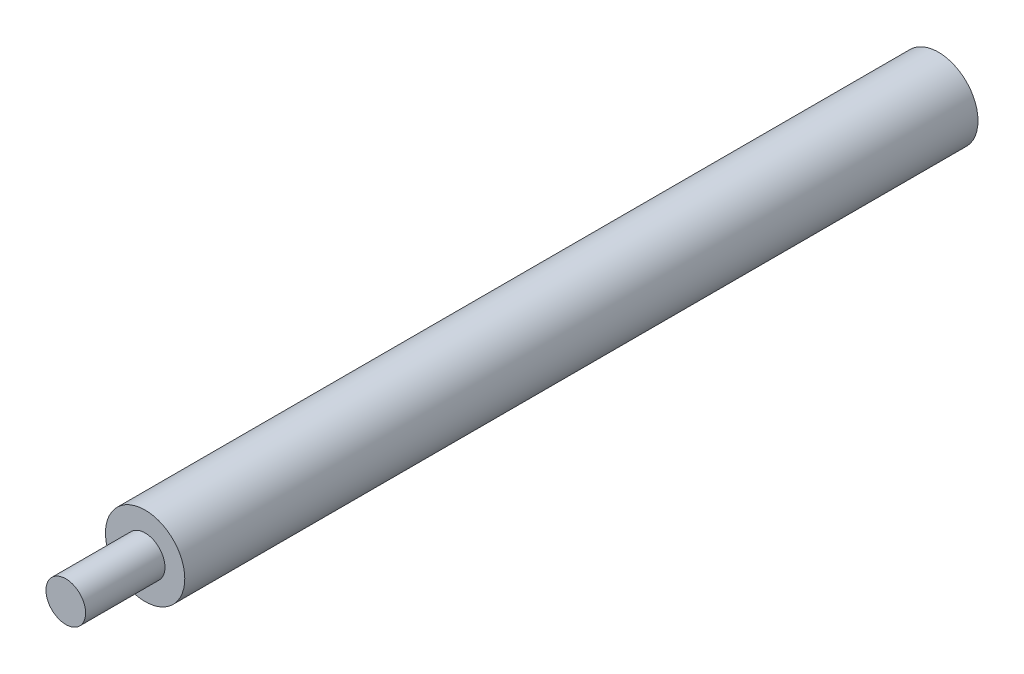
ISO-10303-21;
HEADER;
FILE_DESCRIPTION(('STEP AP214'),'2;1');
FILE_NAME('part.step','',(''),(''),'','','');
FILE_SCHEMA(('AUTOMOTIVE_DESIGN { 1 0 10303 214 1 1 1 1 }'));
ENDSEC;
DATA;
#1=APPLICATION_CONTEXT('core data for automotive mechanical design processes');
#2=APPLICATION_PROTOCOL_DEFINITION('international standard','automotive_design',2000,#1);
#3=PRODUCT_CONTEXT('',#1,'mechanical');
#4=PRODUCT('Part','Part','',(#3));
#5=PRODUCT_RELATED_PRODUCT_CATEGORY('part','',(#4));
#6=PRODUCT_DEFINITION_FORMATION('','',#4);
#7=PRODUCT_DEFINITION_CONTEXT('part definition',#1,'design');
#8=PRODUCT_DEFINITION('design','',#6,#7);
#9=PRODUCT_DEFINITION_SHAPE('','',#8);
#10=(LENGTH_UNIT() NAMED_UNIT(*) SI_UNIT(.MILLI.,.METRE.));
#11=(NAMED_UNIT(*) PLANE_ANGLE_UNIT() SI_UNIT($,.RADIAN.));
#12=(NAMED_UNIT(*) SI_UNIT($,.STERADIAN.) SOLID_ANGLE_UNIT());
#13=UNCERTAINTY_MEASURE_WITH_UNIT(LENGTH_MEASURE(1.E-05),#10,'distance_accuracy_value','');
#14=(GEOMETRIC_REPRESENTATION_CONTEXT(3) GLOBAL_UNCERTAINTY_ASSIGNED_CONTEXT((#13)) GLOBAL_UNIT_ASSIGNED_CONTEXT((#10,
#11,#12)) REPRESENTATION_CONTEXT('',''));
#15=CARTESIAN_POINT('',(0.,0.,0.));
#16=DIRECTION('',(0.,0.,1.));
#17=DIRECTION('',(1.,0.,0.));
#18=AXIS2_PLACEMENT_3D('',#15,#16,#17);
#19=CARTESIAN_POINT('',(0.,0.,50.));
#20=DIRECTION('',(0.,0.,-1.));
#21=DIRECTION('',(-1.,0.,0.));
#22=AXIS2_PLACEMENT_3D('',#19,#20,#21);
#23=CYLINDRICAL_SURFACE('',#22,2.5);
#24=CARTESIAN_POINT('',(0.,0.,50.));
#25=DIRECTION('',(0.,0.,1.));
#26=DIRECTION('',(1.,0.,0.));
#27=AXIS2_PLACEMENT_3D('',#24,#25,#26);
#28=CIRCLE('',#27,2.5);
#29=CARTESIAN_POINT('',(2.5,0.,50.));
#30=VERTEX_POINT('',#29);
#31=EDGE_CURVE('E45',#30,#30,#28,.T.);
#32=ORIENTED_EDGE('',*,*,#31,.F.);
#33=EDGE_LOOP('',(#32));
#34=FACE_BOUND('',#33,.T.);
#35=CARTESIAN_POINT('',(0.,0.,0.));
#36=DIRECTION('',(0.,0.,1.));
#37=DIRECTION('',(1.,0.,0.));
#38=AXIS2_PLACEMENT_3D('',#35,#36,#37);
#39=CIRCLE('',#38,2.5);
#40=CARTESIAN_POINT('',(2.5,0.,0.));
#41=VERTEX_POINT('',#40);
#42=EDGE_CURVE('E40',#41,#41,#39,.T.);
#43=ORIENTED_EDGE('',*,*,#42,.T.);
#44=EDGE_LOOP('',(#43));
#45=FACE_BOUND('',#44,.T.);
#46=ADVANCED_FACE('F37',(#34,#45),#23,.T.);
#47=CARTESIAN_POINT('',(0.,0.,50.));
#48=DIRECTION('',(0.,0.,1.));
#49=DIRECTION('',(1.,0.,0.));
#50=AXIS2_PLACEMENT_3D('',#47,#48,#49);
#51=PLANE('',#50);
#52=CARTESIAN_POINT('',(0.,0.,50.));
#53=DIRECTION('',(0.,0.,1.));
#54=DIRECTION('',(1.,0.,0.));
#55=AXIS2_PLACEMENT_3D('',#52,#53,#54);
#56=CIRCLE('',#55,1.25);
#57=CARTESIAN_POINT('',(1.25,0.,50.));
#58=VERTEX_POINT('',#57);
#59=EDGE_CURVE('E10',#58,#58,#56,.T.);
#60=ORIENTED_EDGE('',*,*,#59,.F.);
#61=EDGE_LOOP('',(#60));
#62=FACE_BOUND('',#61,.T.);
#63=ORIENTED_EDGE('',*,*,#31,.T.);
#64=EDGE_LOOP('',(#63));
#65=FACE_BOUND('',#64,.T.);
#66=ADVANCED_FACE('F78',(#62,#65),#51,.T.);
#67=CARTESIAN_POINT('',(0.,0.,0.));
#68=DIRECTION('',(0.,0.,1.));
#69=DIRECTION('',(1.,0.,0.));
#70=AXIS2_PLACEMENT_3D('',#67,#68,#69);
#71=PLANE('',#70);
#72=CARTESIAN_POINT('',(0.,0.,0.));
#73=DIRECTION('',(0.,0.,-1.));
#74=DIRECTION('',(-1.,0.,0.));
#75=AXIS2_PLACEMENT_3D('',#72,#73,#74);
#76=CIRCLE('',#75,1.25);
#77=CARTESIAN_POINT('',(-1.25,0.,0.));
#78=VERTEX_POINT('',#77);
#79=EDGE_CURVE('E57',#78,#78,#76,.T.);
#80=ORIENTED_EDGE('',*,*,#79,.F.);
#81=EDGE_LOOP('',(#80));
#82=FACE_BOUND('',#81,.T.);
#83=ORIENTED_EDGE('',*,*,#42,.F.);
#84=EDGE_LOOP('',(#83));
#85=FACE_BOUND('',#84,.T.);
#86=ADVANCED_FACE('F74',(#82,#85),#71,.F.);
#87=CARTESIAN_POINT('',(0.,0.,55.));
#88=DIRECTION('',(0.,0.,-1.));
#89=DIRECTION('',(-1.,0.,0.));
#90=AXIS2_PLACEMENT_3D('',#87,#88,#89);
#91=CYLINDRICAL_SURFACE('',#90,1.25);
#92=CARTESIAN_POINT('',(0.,0.,55.));
#93=DIRECTION('',(0.,0.,1.));
#94=DIRECTION('',(1.,0.,0.));
#95=AXIS2_PLACEMENT_3D('',#92,#93,#94);
#96=CIRCLE('',#95,1.25);
#97=CARTESIAN_POINT('',(1.25,0.,55.));
#98=VERTEX_POINT('',#97);
#99=EDGE_CURVE('E52',#98,#98,#96,.T.);
#100=ORIENTED_EDGE('',*,*,#99,.F.);
#101=EDGE_LOOP('',(#100));
#102=FACE_BOUND('',#101,.T.);
#103=ORIENTED_EDGE('',*,*,#59,.T.);
#104=EDGE_LOOP('',(#103));
#105=FACE_BOUND('',#104,.T.);
#106=ADVANCED_FACE('F77',(#102,#105),#91,.T.);
#107=CARTESIAN_POINT('',(0.,0.,55.));
#108=DIRECTION('',(0.,0.,1.));
#109=DIRECTION('',(1.,0.,0.));
#110=AXIS2_PLACEMENT_3D('',#107,#108,#109);
#111=PLANE('',#110);
#112=ORIENTED_EDGE('',*,*,#99,.T.);
#113=EDGE_LOOP('',(#112));
#114=FACE_BOUND('',#113,.T.);
#115=ADVANCED_FACE('F70',(#114),#111,.T.);
#116=CARTESIAN_POINT('',(0.,0.,5.));
#117=DIRECTION('',(0.,0.,-1.));
#118=DIRECTION('',(-1.,0.,0.));
#119=AXIS2_PLACEMENT_3D('',#116,#117,#118);
#120=CYLINDRICAL_SURFACE('',#119,1.25);
#121=CARTESIAN_POINT('',(0.,0.,5.));
#122=DIRECTION('',(0.,0.,-1.));
#123=DIRECTION('',(-1.,0.,0.));
#124=AXIS2_PLACEMENT_3D('',#121,#122,#123);
#125=CIRCLE('',#124,1.25);
#126=CARTESIAN_POINT('',(-1.25,0.,5.));
#127=VERTEX_POINT('',#126);
#128=EDGE_CURVE('E56',#127,#127,#125,.T.);
#129=ORIENTED_EDGE('',*,*,#128,.F.);
#130=EDGE_LOOP('',(#129));
#131=FACE_BOUND('',#130,.T.);
#132=ORIENTED_EDGE('',*,*,#79,.T.);
#133=EDGE_LOOP('',(#132));
#134=FACE_BOUND('',#133,.T.);
#135=ADVANCED_FACE('F67',(#131,#134),#120,.F.);
#136=CARTESIAN_POINT('',(0.,0.,5.));
#137=DIRECTION('',(0.,0.,-1.));
#138=DIRECTION('',(-1.,0.,0.));
#139=AXIS2_PLACEMENT_3D('',#136,#137,#138);
#140=PLANE('',#139);
#141=ORIENTED_EDGE('',*,*,#128,.T.);
#142=EDGE_LOOP('',(#141));
#143=FACE_BOUND('',#142,.T.);
#144=ADVANCED_FACE('F65',(#143),#140,.T.);
#145=CLOSED_SHELL('',(#46,#66,#86,#106,#115,#135,#144));
#146=MANIFOLD_SOLID_BREP('B2',#145);
#147=ADVANCED_BREP_SHAPE_REPRESENTATION('',(#18,#146),#14);
#148=SHAPE_DEFINITION_REPRESENTATION(#9,#147);
ENDSEC;
END-ISO-10303-21;
